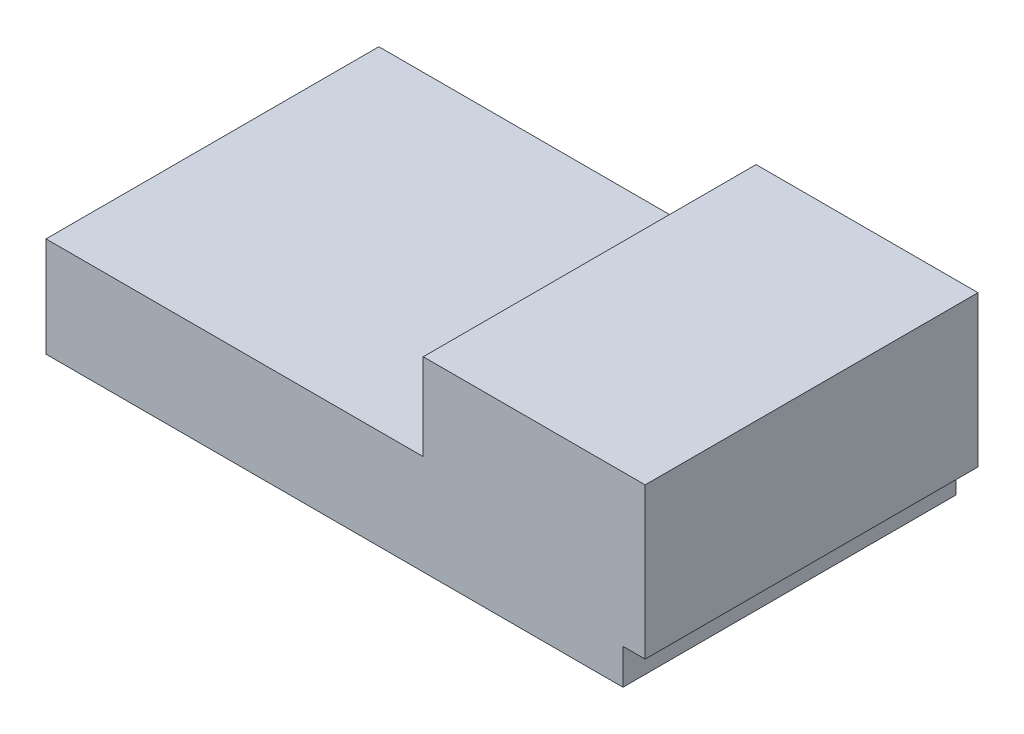
ISO-10303-21;
HEADER;
FILE_DESCRIPTION(('STEP AP214'),'2;1');
FILE_NAME('part.step','',(''),(''),'','','');
FILE_SCHEMA(('AUTOMOTIVE_DESIGN { 1 0 10303 214 1 1 1 1 }'));
ENDSEC;
DATA;
#1=APPLICATION_CONTEXT('core data for automotive mechanical design processes');
#2=APPLICATION_PROTOCOL_DEFINITION('international standard','automotive_design',2000,#1);
#3=PRODUCT_CONTEXT('',#1,'mechanical');
#4=PRODUCT('Part','Part','',(#3));
#5=PRODUCT_RELATED_PRODUCT_CATEGORY('part','',(#4));
#6=PRODUCT_DEFINITION_FORMATION('','',#4);
#7=PRODUCT_DEFINITION_CONTEXT('part definition',#1,'design');
#8=PRODUCT_DEFINITION('design','',#6,#7);
#9=PRODUCT_DEFINITION_SHAPE('','',#8);
#10=(LENGTH_UNIT() NAMED_UNIT(*) SI_UNIT(.MILLI.,.METRE.));
#11=(NAMED_UNIT(*) PLANE_ANGLE_UNIT() SI_UNIT($,.RADIAN.));
#12=(NAMED_UNIT(*) SI_UNIT($,.STERADIAN.) SOLID_ANGLE_UNIT());
#13=UNCERTAINTY_MEASURE_WITH_UNIT(LENGTH_MEASURE(1.E-05),#10,'distance_accuracy_value','');
#14=(GEOMETRIC_REPRESENTATION_CONTEXT(3) GLOBAL_UNCERTAINTY_ASSIGNED_CONTEXT((#13)) GLOBAL_UNIT_ASSIGNED_CONTEXT((#10,
#11,#12)) REPRESENTATION_CONTEXT('',''));
#15=CARTESIAN_POINT('',(0.,0.,0.));
#16=DIRECTION('',(0.,0.,1.));
#17=DIRECTION('',(1.,0.,0.));
#18=AXIS2_PLACEMENT_3D('',#15,#16,#17);
#19=CARTESIAN_POINT('',(26.,0.,15.));
#20=DIRECTION('',(0.,1.,0.));
#21=DIRECTION('',(0.,0.,1.));
#22=AXIS2_PLACEMENT_3D('',#19,#20,#21);
#23=PLANE('',#22);
#24=DIRECTION('',(1.,0.,0.));
#25=VECTOR('',#24,1.);
#26=CARTESIAN_POINT('',(26.,0.,0.));
#27=LINE('',#26,#25);
#28=CARTESIAN_POINT('',(0.,0.,0.));
#29=VERTEX_POINT('',#28);
#30=CARTESIAN_POINT('',(26.,0.,0.));
#31=VERTEX_POINT('',#30);
#32=EDGE_CURVE('E131',#29,#31,#27,.T.);
#33=ORIENTED_EDGE('',*,*,#32,.T.);
#34=DIRECTION('',(0.,0.,-1.));
#35=VECTOR('',#34,1.);
#36=CARTESIAN_POINT('',(26.,0.,15.));
#37=LINE('',#36,#35);
#38=CARTESIAN_POINT('',(26.,0.,15.));
#39=VERTEX_POINT('',#38);
#40=EDGE_CURVE('E11',#39,#31,#37,.T.);
#41=ORIENTED_EDGE('',*,*,#40,.F.);
#42=DIRECTION('',(1.,0.,0.));
#43=VECTOR('',#42,1.);
#44=CARTESIAN_POINT('',(26.,0.,15.));
#45=LINE('',#44,#43);
#46=CARTESIAN_POINT('',(0.,0.,15.));
#47=VERTEX_POINT('',#46);
#48=EDGE_CURVE('E145',#47,#39,#45,.T.);
#49=ORIENTED_EDGE('',*,*,#48,.F.);
#50=DIRECTION('',(0.,0.,-1.));
#51=VECTOR('',#50,1.);
#52=CARTESIAN_POINT('',(0.,0.,15.));
#53=LINE('',#52,#51);
#54=EDGE_CURVE('E127',#47,#29,#53,.T.);
#55=ORIENTED_EDGE('',*,*,#54,.T.);
#56=EDGE_LOOP('',(#33,#41,#49,#55));
#57=FACE_BOUND('',#56,.T.);
#58=ADVANCED_FACE('F35',(#57),#23,.F.);
#59=CARTESIAN_POINT('',(26.,1.6,15.));
#60=DIRECTION('',(-1.,0.,0.));
#61=DIRECTION('',(0.,0.,1.));
#62=AXIS2_PLACEMENT_3D('',#59,#60,#61);
#63=PLANE('',#62);
#64=DIRECTION('',(0.,1.,0.));
#65=VECTOR('',#64,1.);
#66=CARTESIAN_POINT('',(26.,1.6,0.));
#67=LINE('',#66,#65);
#68=CARTESIAN_POINT('',(26.,1.6,0.));
#69=VERTEX_POINT('',#68);
#70=EDGE_CURVE('E134',#31,#69,#67,.T.);
#71=ORIENTED_EDGE('',*,*,#70,.T.);
#72=DIRECTION('',(0.,0.,-1.));
#73=VECTOR('',#72,1.);
#74=CARTESIAN_POINT('',(26.,1.6,15.));
#75=LINE('',#74,#73);
#76=CARTESIAN_POINT('',(26.,1.6,15.));
#77=VERTEX_POINT('',#76);
#78=EDGE_CURVE('E43',#77,#69,#75,.T.);
#79=ORIENTED_EDGE('',*,*,#78,.F.);
#80=DIRECTION('',(0.,1.,0.));
#81=VECTOR('',#80,1.);
#82=CARTESIAN_POINT('',(26.,1.6,15.));
#83=LINE('',#82,#81);
#84=EDGE_CURVE('E94',#39,#77,#83,.T.);
#85=ORIENTED_EDGE('',*,*,#84,.F.);
#86=ORIENTED_EDGE('',*,*,#40,.T.);
#87=EDGE_LOOP('',(#71,#79,#85,#86));
#88=FACE_BOUND('',#87,.T.);
#89=ADVANCED_FACE('F180',(#88),#63,.F.);
#90=CARTESIAN_POINT('',(27.,1.6,15.));
#91=DIRECTION('',(0.,1.,0.));
#92=DIRECTION('',(0.,0.,1.));
#93=AXIS2_PLACEMENT_3D('',#90,#91,#92);
#94=PLANE('',#93);
#95=DIRECTION('',(1.,0.,0.));
#96=VECTOR('',#95,1.);
#97=CARTESIAN_POINT('',(27.,1.6,0.));
#98=LINE('',#97,#96);
#99=CARTESIAN_POINT('',(27.,1.6,0.));
#100=VERTEX_POINT('',#99);
#101=EDGE_CURVE('E136',#69,#100,#98,.T.);
#102=ORIENTED_EDGE('',*,*,#101,.T.);
#103=DIRECTION('',(0.,0.,-1.));
#104=VECTOR('',#103,1.);
#105=CARTESIAN_POINT('',(27.,1.6,15.));
#106=LINE('',#105,#104);
#107=CARTESIAN_POINT('',(27.,1.6,15.));
#108=VERTEX_POINT('',#107);
#109=EDGE_CURVE('E152',#108,#100,#106,.T.);
#110=ORIENTED_EDGE('',*,*,#109,.F.);
#111=DIRECTION('',(1.,0.,0.));
#112=VECTOR('',#111,1.);
#113=CARTESIAN_POINT('',(27.,1.6,15.));
#114=LINE('',#113,#112);
#115=EDGE_CURVE('E160',#77,#108,#114,.T.);
#116=ORIENTED_EDGE('',*,*,#115,.F.);
#117=ORIENTED_EDGE('',*,*,#78,.T.);
#118=EDGE_LOOP('',(#102,#110,#116,#117));
#119=FACE_BOUND('',#118,.T.);
#120=ADVANCED_FACE('F158',(#119),#94,.F.);
#121=CARTESIAN_POINT('',(27.,8.4,15.));
#122=DIRECTION('',(-1.,0.,0.));
#123=DIRECTION('',(0.,0.,1.));
#124=AXIS2_PLACEMENT_3D('',#121,#122,#123);
#125=PLANE('',#124);
#126=DIRECTION('',(0.,1.,0.));
#127=VECTOR('',#126,1.);
#128=CARTESIAN_POINT('',(27.,8.4,0.));
#129=LINE('',#128,#127);
#130=CARTESIAN_POINT('',(27.,8.4,0.));
#131=VERTEX_POINT('',#130);
#132=EDGE_CURVE('E138',#100,#131,#129,.T.);
#133=ORIENTED_EDGE('',*,*,#132,.T.);
#134=DIRECTION('',(0.,0.,-1.));
#135=VECTOR('',#134,1.);
#136=CARTESIAN_POINT('',(27.,8.4,15.));
#137=LINE('',#136,#135);
#138=CARTESIAN_POINT('',(27.,8.4,15.));
#139=VERTEX_POINT('',#138);
#140=EDGE_CURVE('E149',#139,#131,#137,.T.);
#141=ORIENTED_EDGE('',*,*,#140,.F.);
#142=DIRECTION('',(0.,1.,0.));
#143=VECTOR('',#142,1.);
#144=CARTESIAN_POINT('',(27.,8.4,15.));
#145=LINE('',#144,#143);
#146=EDGE_CURVE('E172',#108,#139,#145,.T.);
#147=ORIENTED_EDGE('',*,*,#146,.F.);
#148=ORIENTED_EDGE('',*,*,#109,.T.);
#149=EDGE_LOOP('',(#133,#141,#147,#148));
#150=FACE_BOUND('',#149,.T.);
#151=ADVANCED_FACE('F168',(#150),#125,.F.);
#152=CARTESIAN_POINT('',(17.,8.4,15.));
#153=DIRECTION('',(0.,-1.,0.));
#154=DIRECTION('',(0.,0.,-1.));
#155=AXIS2_PLACEMENT_3D('',#152,#153,#154);
#156=PLANE('',#155);
#157=DIRECTION('',(-1.,0.,0.));
#158=VECTOR('',#157,1.);
#159=CARTESIAN_POINT('',(17.,8.4,0.));
#160=LINE('',#159,#158);
#161=CARTESIAN_POINT('',(17.,8.4,0.));
#162=VERTEX_POINT('',#161);
#163=EDGE_CURVE('E140',#131,#162,#160,.T.);
#164=ORIENTED_EDGE('',*,*,#163,.T.);
#165=DIRECTION('',(0.,0.,-1.));
#166=VECTOR('',#165,1.);
#167=CARTESIAN_POINT('',(17.,8.4,15.));
#168=LINE('',#167,#166);
#169=CARTESIAN_POINT('',(17.,8.4,15.));
#170=VERTEX_POINT('',#169);
#171=EDGE_CURVE('E122',#170,#162,#168,.T.);
#172=ORIENTED_EDGE('',*,*,#171,.F.);
#173=DIRECTION('',(-1.,0.,0.));
#174=VECTOR('',#173,1.);
#175=CARTESIAN_POINT('',(17.,8.4,15.));
#176=LINE('',#175,#174);
#177=EDGE_CURVE('E113',#139,#170,#176,.T.);
#178=ORIENTED_EDGE('',*,*,#177,.F.);
#179=ORIENTED_EDGE('',*,*,#140,.T.);
#180=EDGE_LOOP('',(#164,#172,#178,#179));
#181=FACE_BOUND('',#180,.T.);
#182=ADVANCED_FACE('F171',(#181),#156,.F.);
#183=CARTESIAN_POINT('',(17.,4.5,15.));
#184=DIRECTION('',(1.,0.,0.));
#185=DIRECTION('',(0.,0.,-1.));
#186=AXIS2_PLACEMENT_3D('',#183,#184,#185);
#187=PLANE('',#186);
#188=DIRECTION('',(0.,-1.,0.));
#189=VECTOR('',#188,1.);
#190=CARTESIAN_POINT('',(17.,4.5,0.));
#191=LINE('',#190,#189);
#192=CARTESIAN_POINT('',(17.,4.5,0.));
#193=VERTEX_POINT('',#192);
#194=EDGE_CURVE('E121',#162,#193,#191,.T.);
#195=ORIENTED_EDGE('',*,*,#194,.T.);
#196=DIRECTION('',(0.,0.,-1.));
#197=VECTOR('',#196,1.);
#198=CARTESIAN_POINT('',(17.,4.5,15.));
#199=LINE('',#198,#197);
#200=CARTESIAN_POINT('',(17.,4.5,15.));
#201=VERTEX_POINT('',#200);
#202=EDGE_CURVE('E118',#201,#193,#199,.T.);
#203=ORIENTED_EDGE('',*,*,#202,.F.);
#204=DIRECTION('',(0.,-1.,0.));
#205=VECTOR('',#204,1.);
#206=CARTESIAN_POINT('',(17.,4.5,15.));
#207=LINE('',#206,#205);
#208=EDGE_CURVE('E107',#170,#201,#207,.T.);
#209=ORIENTED_EDGE('',*,*,#208,.F.);
#210=ORIENTED_EDGE('',*,*,#171,.T.);
#211=EDGE_LOOP('',(#195,#203,#209,#210));
#212=FACE_BOUND('',#211,.T.);
#213=ADVANCED_FACE('F119',(#212),#187,.F.);
#214=CARTESIAN_POINT('',(0.,4.5,15.));
#215=DIRECTION('',(0.,-1.,0.));
#216=DIRECTION('',(0.,0.,-1.));
#217=AXIS2_PLACEMENT_3D('',#214,#215,#216);
#218=PLANE('',#217);
#219=DIRECTION('',(-1.,0.,0.));
#220=VECTOR('',#219,1.);
#221=CARTESIAN_POINT('',(0.,4.5,0.));
#222=LINE('',#221,#220);
#223=CARTESIAN_POINT('',(0.,4.5,0.));
#224=VERTEX_POINT('',#223);
#225=EDGE_CURVE('E80',#193,#224,#222,.T.);
#226=ORIENTED_EDGE('',*,*,#225,.T.);
#227=DIRECTION('',(0.,0.,-1.));
#228=VECTOR('',#227,1.);
#229=CARTESIAN_POINT('',(0.,4.5,15.));
#230=LINE('',#229,#228);
#231=CARTESIAN_POINT('',(0.,4.5,15.));
#232=VERTEX_POINT('',#231);
#233=EDGE_CURVE('E123',#232,#224,#230,.T.);
#234=ORIENTED_EDGE('',*,*,#233,.F.);
#235=DIRECTION('',(-1.,0.,0.));
#236=VECTOR('',#235,1.);
#237=CARTESIAN_POINT('',(0.,4.5,15.));
#238=LINE('',#237,#236);
#239=EDGE_CURVE('E111',#201,#232,#238,.T.);
#240=ORIENTED_EDGE('',*,*,#239,.F.);
#241=ORIENTED_EDGE('',*,*,#202,.T.);
#242=EDGE_LOOP('',(#226,#234,#240,#241));
#243=FACE_BOUND('',#242,.T.);
#244=ADVANCED_FACE('F125',(#243),#218,.F.);
#245=CARTESIAN_POINT('',(0.,0.,15.));
#246=DIRECTION('',(1.,0.,0.));
#247=DIRECTION('',(0.,0.,-1.));
#248=AXIS2_PLACEMENT_3D('',#245,#246,#247);
#249=PLANE('',#248);
#250=DIRECTION('',(0.,-1.,0.));
#251=VECTOR('',#250,1.);
#252=CARTESIAN_POINT('',(0.,0.,0.));
#253=LINE('',#252,#251);
#254=EDGE_CURVE('E86',#224,#29,#253,.T.);
#255=ORIENTED_EDGE('',*,*,#254,.T.);
#256=ORIENTED_EDGE('',*,*,#54,.F.);
#257=DIRECTION('',(0.,-1.,0.));
#258=VECTOR('',#257,1.);
#259=CARTESIAN_POINT('',(0.,0.,15.));
#260=LINE('',#259,#258);
#261=EDGE_CURVE('E51',#232,#47,#260,.T.);
#262=ORIENTED_EDGE('',*,*,#261,.F.);
#263=ORIENTED_EDGE('',*,*,#233,.T.);
#264=EDGE_LOOP('',(#255,#256,#262,#263));
#265=FACE_BOUND('',#264,.T.);
#266=ADVANCED_FACE('F196',(#265),#249,.F.);
#267=CARTESIAN_POINT('',(0.,0.,15.));
#268=DIRECTION('',(0.,0.,-1.));
#269=DIRECTION('',(-1.,0.,0.));
#270=AXIS2_PLACEMENT_3D('',#267,#268,#269);
#271=PLANE('',#270);
#272=ORIENTED_EDGE('',*,*,#48,.T.);
#273=ORIENTED_EDGE('',*,*,#84,.T.);
#274=ORIENTED_EDGE('',*,*,#115,.T.);
#275=ORIENTED_EDGE('',*,*,#146,.T.);
#276=ORIENTED_EDGE('',*,*,#177,.T.);
#277=ORIENTED_EDGE('',*,*,#208,.T.);
#278=ORIENTED_EDGE('',*,*,#239,.T.);
#279=ORIENTED_EDGE('',*,*,#261,.T.);
#280=EDGE_LOOP('',(#272,#273,#274,#275,#276,#277,#278,#279));
#281=FACE_BOUND('',#280,.T.);
#282=ADVANCED_FACE('F109',(#281),#271,.F.);
#283=CARTESIAN_POINT('',(0.,0.,0.));
#284=DIRECTION('',(0.,0.,-1.));
#285=DIRECTION('',(-1.,0.,0.));
#286=AXIS2_PLACEMENT_3D('',#283,#284,#285);
#287=PLANE('',#286);
#288=ORIENTED_EDGE('',*,*,#32,.F.);
#289=ORIENTED_EDGE('',*,*,#254,.F.);
#290=ORIENTED_EDGE('',*,*,#225,.F.);
#291=ORIENTED_EDGE('',*,*,#194,.F.);
#292=ORIENTED_EDGE('',*,*,#163,.F.);
#293=ORIENTED_EDGE('',*,*,#132,.F.);
#294=ORIENTED_EDGE('',*,*,#101,.F.);
#295=ORIENTED_EDGE('',*,*,#70,.F.);
#296=EDGE_LOOP('',(#288,#289,#290,#291,#292,#293,#294,#295));
#297=FACE_BOUND('',#296,.T.);
#298=ADVANCED_FACE('F164',(#297),#287,.T.);
#299=CLOSED_SHELL('',(#58,#89,#120,#151,#182,#213,#244,#266,#282,#298));
#300=MANIFOLD_SOLID_BREP('B2',#299);
#301=ADVANCED_BREP_SHAPE_REPRESENTATION('',(#18,#300),#14);
#302=SHAPE_DEFINITION_REPRESENTATION(#9,#301);
ENDSEC;
END-ISO-10303-21;
